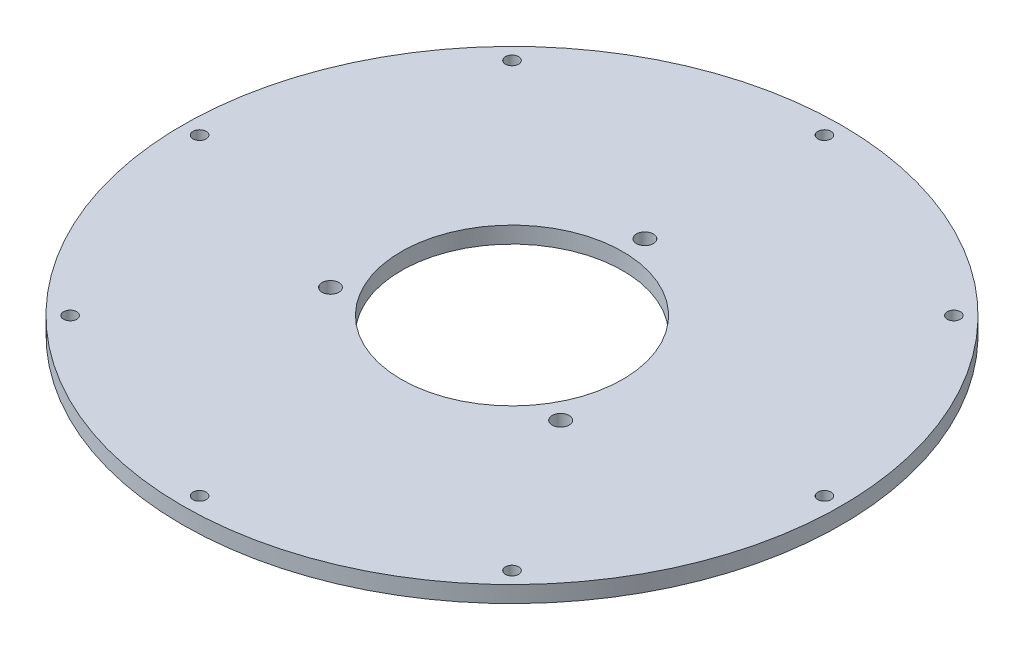
ISO-10303-21;
HEADER;
FILE_DESCRIPTION(('STEP AP214'),'2;1');
FILE_NAME('part.step','',(''),(''),'','','');
FILE_SCHEMA(('AUTOMOTIVE_DESIGN { 1 0 10303 214 1 1 1 1 }'));
ENDSEC;
DATA;
#1=APPLICATION_CONTEXT('core data for automotive mechanical design processes');
#2=APPLICATION_PROTOCOL_DEFINITION('international standard','automotive_design',2000,#1);
#3=PRODUCT_CONTEXT('',#1,'mechanical');
#4=PRODUCT('Part','Part','',(#3));
#5=PRODUCT_RELATED_PRODUCT_CATEGORY('part','',(#4));
#6=PRODUCT_DEFINITION_FORMATION('','',#4);
#7=PRODUCT_DEFINITION_CONTEXT('part definition',#1,'design');
#8=PRODUCT_DEFINITION('design','',#6,#7);
#9=PRODUCT_DEFINITION_SHAPE('','',#8);
#10=(LENGTH_UNIT() NAMED_UNIT(*) SI_UNIT(.MILLI.,.METRE.));
#11=(NAMED_UNIT(*) PLANE_ANGLE_UNIT() SI_UNIT($,.RADIAN.));
#12=(NAMED_UNIT(*) SI_UNIT($,.STERADIAN.) SOLID_ANGLE_UNIT());
#13=UNCERTAINTY_MEASURE_WITH_UNIT(LENGTH_MEASURE(1.E-05),#10,'distance_accuracy_value','');
#14=(GEOMETRIC_REPRESENTATION_CONTEXT(3) GLOBAL_UNCERTAINTY_ASSIGNED_CONTEXT((#13)) GLOBAL_UNIT_ASSIGNED_CONTEXT((#10,
#11,#12)) REPRESENTATION_CONTEXT('',''));
#15=CARTESIAN_POINT('',(0.,0.,0.));
#16=DIRECTION('',(0.,0.,1.));
#17=DIRECTION('',(1.,0.,0.));
#18=AXIS2_PLACEMENT_3D('',#15,#16,#17);
#19=CARTESIAN_POINT('',(0.,3.125,0.));
#20=DIRECTION('',(0.,1.,0.));
#21=DIRECTION('',(0.,0.,1.));
#22=AXIS2_PLACEMENT_3D('',#19,#20,#21);
#23=PLANE('',#22);
#24=CARTESIAN_POINT('',(-59.25,3.125,0.));
#25=DIRECTION('',(0.,1.,0.));
#26=DIRECTION('',(0.,0.,1.));
#27=AXIS2_PLACEMENT_3D('',#24,#25,#26);
#28=CIRCLE('',#27,1.25);
#29=CARTESIAN_POINT('',(-59.25,3.125,1.25000000000001));
#30=VERTEX_POINT('',#29);
#31=EDGE_CURVE('E94',#30,#30,#28,.T.);
#32=ORIENTED_EDGE('',*,*,#31,.F.);
#33=EDGE_LOOP('',(#32));
#34=FACE_BOUND('',#33,.T.);
#35=CARTESIAN_POINT('',(41.8960767853029,3.125,41.8960767853029));
#36=DIRECTION('',(0.,1.,0.));
#37=DIRECTION('',(0.,0.,1.));
#38=AXIS2_PLACEMENT_3D('',#35,#36,#37);
#39=CIRCLE('',#38,1.25);
#40=CARTESIAN_POINT('',(41.8960767853029,3.125,43.146076785303));
#41=VERTEX_POINT('',#40);
#42=EDGE_CURVE('E83',#41,#41,#39,.T.);
#43=ORIENTED_EDGE('',*,*,#42,.F.);
#44=EDGE_LOOP('',(#43));
#45=FACE_BOUND('',#44,.T.);
#46=CARTESIAN_POINT('',(-41.8960767853029,3.125,41.8960767853029));
#47=DIRECTION('',(0.,1.,0.));
#48=DIRECTION('',(0.,0.,1.));
#49=AXIS2_PLACEMENT_3D('',#46,#47,#48);
#50=CIRCLE('',#49,1.25);
#51=CARTESIAN_POINT('',(-41.8960767853029,3.125,43.1460767853029));
#52=VERTEX_POINT('',#51);
#53=EDGE_CURVE('E82',#52,#52,#50,.T.);
#54=ORIENTED_EDGE('',*,*,#53,.F.);
#55=EDGE_LOOP('',(#54));
#56=FACE_BOUND('',#55,.T.);
#57=CARTESIAN_POINT('',(41.8960767853029,3.125,-41.8960767853029));
#58=DIRECTION('',(0.,1.,0.));
#59=DIRECTION('',(0.,0.,1.));
#60=AXIS2_PLACEMENT_3D('',#57,#58,#59);
#61=CIRCLE('',#60,1.25);
#62=CARTESIAN_POINT('',(41.8960767853029,3.125,-40.6460767853029));
#63=VERTEX_POINT('',#62);
#64=EDGE_CURVE('E76',#63,#63,#61,.T.);
#65=ORIENTED_EDGE('',*,*,#64,.F.);
#66=EDGE_LOOP('',(#65));
#67=FACE_BOUND('',#66,.T.);
#68=CARTESIAN_POINT('',(59.25,3.125,0.));
#69=DIRECTION('',(0.,1.,0.));
#70=DIRECTION('',(0.,0.,1.));
#71=AXIS2_PLACEMENT_3D('',#68,#69,#70);
#72=CIRCLE('',#71,1.25);
#73=CARTESIAN_POINT('',(59.25,3.125,1.24999999999997));
#74=VERTEX_POINT('',#73);
#75=EDGE_CURVE('E95',#74,#74,#72,.T.);
#76=ORIENTED_EDGE('',*,*,#75,.F.);
#77=EDGE_LOOP('',(#76));
#78=FACE_BOUND('',#77,.T.);
#79=CARTESIAN_POINT('',(0.,3.125,-59.25));
#80=DIRECTION('',(0.,1.,0.));
#81=DIRECTION('',(0.,0.,1.));
#82=AXIS2_PLACEMENT_3D('',#79,#80,#81);
#83=CIRCLE('',#82,1.25);
#84=CARTESIAN_POINT('',(0.,3.125,-58.));
#85=VERTEX_POINT('',#84);
#86=EDGE_CURVE('E112',#85,#85,#83,.T.);
#87=ORIENTED_EDGE('',*,*,#86,.F.);
#88=EDGE_LOOP('',(#87));
#89=FACE_BOUND('',#88,.T.);
#90=CARTESIAN_POINT('',(0.,3.125,59.25));
#91=DIRECTION('',(0.,1.,0.));
#92=DIRECTION('',(0.,0.,1.));
#93=AXIS2_PLACEMENT_3D('',#90,#91,#92);
#94=CIRCLE('',#93,1.25);
#95=CARTESIAN_POINT('',(0.,3.125,60.5));
#96=VERTEX_POINT('',#95);
#97=EDGE_CURVE('E106',#96,#96,#94,.T.);
#98=ORIENTED_EDGE('',*,*,#97,.F.);
#99=EDGE_LOOP('',(#98));
#100=FACE_BOUND('',#99,.T.);
#101=CARTESIAN_POINT('',(-41.8960767853029,3.125,-41.8960767853029));
#102=DIRECTION('',(0.,1.,0.));
#103=DIRECTION('',(0.,0.,1.));
#104=AXIS2_PLACEMENT_3D('',#101,#102,#103);
#105=CIRCLE('',#104,1.25);
#106=CARTESIAN_POINT('',(-41.8960767853029,3.125,-40.6460767853029));
#107=VERTEX_POINT('',#106);
#108=EDGE_CURVE('E73',#107,#107,#105,.T.);
#109=ORIENTED_EDGE('',*,*,#108,.F.);
#110=EDGE_LOOP('',(#109));
#111=FACE_BOUND('',#110,.T.);
#112=CARTESIAN_POINT('',(1.39713240976391E-13,3.125,-25.2));
#113=DIRECTION('',(0.,1.,0.));
#114=DIRECTION('',(0.,0.,1.));
#115=AXIS2_PLACEMENT_3D('',#112,#113,#114);
#116=CIRCLE('',#115,1.6);
#117=CARTESIAN_POINT('',(1.39713240976391E-13,3.125,-23.6));
#118=VERTEX_POINT('',#117);
#119=EDGE_CURVE('E68',#118,#118,#116,.T.);
#120=ORIENTED_EDGE('',*,*,#119,.F.);
#121=EDGE_LOOP('',(#120));
#122=FACE_BOUND('',#121,.T.);
#123=CARTESIAN_POINT('',(21.8238401753678,3.125,12.6000000000001));
#124=DIRECTION('',(0.,1.,0.));
#125=DIRECTION('',(0.,0.,1.));
#126=AXIS2_PLACEMENT_3D('',#123,#124,#125);
#127=CIRCLE('',#126,1.6);
#128=CARTESIAN_POINT('',(21.8238401753678,3.125,14.2000000000001));
#129=VERTEX_POINT('',#128);
#130=EDGE_CURVE('E65',#129,#129,#127,.T.);
#131=ORIENTED_EDGE('',*,*,#130,.F.);
#132=EDGE_LOOP('',(#131));
#133=FACE_BOUND('',#132,.T.);
#134=CARTESIAN_POINT('',(-21.8238401753679,3.125,12.5999999999999));
#135=DIRECTION('',(0.,1.,0.));
#136=DIRECTION('',(0.,0.,1.));
#137=AXIS2_PLACEMENT_3D('',#134,#135,#136);
#138=CIRCLE('',#137,1.6);
#139=CARTESIAN_POINT('',(-21.8238401753679,3.125,14.1999999999999));
#140=VERTEX_POINT('',#139);
#141=EDGE_CURVE('E58',#140,#140,#138,.T.);
#142=ORIENTED_EDGE('',*,*,#141,.F.);
#143=EDGE_LOOP('',(#142));
#144=FACE_BOUND('',#143,.T.);
#145=CARTESIAN_POINT('',(0.,3.125,0.));
#146=DIRECTION('',(0.,1.,0.));
#147=DIRECTION('',(0.,0.,1.));
#148=AXIS2_PLACEMENT_3D('',#145,#146,#147);
#149=CIRCLE('',#148,62.5);
#150=CARTESIAN_POINT('',(0.,3.125,62.5));
#151=VERTEX_POINT('',#150);
#152=EDGE_CURVE('E10',#151,#151,#149,.T.);
#153=ORIENTED_EDGE('',*,*,#152,.T.);
#154=EDGE_LOOP('',(#153));
#155=FACE_BOUND('',#154,.T.);
#156=CARTESIAN_POINT('',(0.,3.125,0.));
#157=DIRECTION('',(0.,1.,0.));
#158=DIRECTION('',(0.,0.,1.));
#159=AXIS2_PLACEMENT_3D('',#156,#157,#158);
#160=CIRCLE('',#159,21.);
#161=CARTESIAN_POINT('',(0.,3.125,21.));
#162=VERTEX_POINT('',#161);
#163=EDGE_CURVE('E47',#162,#162,#160,.T.);
#164=ORIENTED_EDGE('',*,*,#163,.F.);
#165=EDGE_LOOP('',(#164));
#166=FACE_BOUND('',#165,.T.);
#167=ADVANCED_FACE('F36',(#34,#45,#56,#67,#78,#89,#100,#111,#122,#133,#144,#155,#166),#23,.T.);
#168=CARTESIAN_POINT('',(0.,0.,0.));
#169=DIRECTION('',(0.,1.,0.));
#170=DIRECTION('',(0.,0.,1.));
#171=AXIS2_PLACEMENT_3D('',#168,#169,#170);
#172=PLANE('',#171);
#173=CARTESIAN_POINT('',(-59.25,0.,0.));
#174=DIRECTION('',(0.,1.,0.));
#175=DIRECTION('',(0.,0.,1.));
#176=AXIS2_PLACEMENT_3D('',#173,#174,#175);
#177=CIRCLE('',#176,1.25);
#178=CARTESIAN_POINT('',(-59.25,0.,1.25000000000001));
#179=VERTEX_POINT('',#178);
#180=EDGE_CURVE('E91',#179,#179,#177,.T.);
#181=ORIENTED_EDGE('',*,*,#180,.T.);
#182=EDGE_LOOP('',(#181));
#183=FACE_BOUND('',#182,.T.);
#184=CARTESIAN_POINT('',(41.8960767853029,0.,41.8960767853029));
#185=DIRECTION('',(0.,1.,0.));
#186=DIRECTION('',(0.,0.,1.));
#187=AXIS2_PLACEMENT_3D('',#184,#185,#186);
#188=CIRCLE('',#187,1.25);
#189=CARTESIAN_POINT('',(41.8960767853029,0.,43.146076785303));
#190=VERTEX_POINT('',#189);
#191=EDGE_CURVE('E98',#190,#190,#188,.T.);
#192=ORIENTED_EDGE('',*,*,#191,.T.);
#193=EDGE_LOOP('',(#192));
#194=FACE_BOUND('',#193,.T.);
#195=CARTESIAN_POINT('',(-41.8960767853029,0.,41.8960767853029));
#196=DIRECTION('',(0.,1.,0.));
#197=DIRECTION('',(0.,0.,1.));
#198=AXIS2_PLACEMENT_3D('',#195,#196,#197);
#199=CIRCLE('',#198,1.25);
#200=CARTESIAN_POINT('',(-41.8960767853029,0.,43.1460767853029));
#201=VERTEX_POINT('',#200);
#202=EDGE_CURVE('E79',#201,#201,#199,.T.);
#203=ORIENTED_EDGE('',*,*,#202,.T.);
#204=EDGE_LOOP('',(#203));
#205=FACE_BOUND('',#204,.T.);
#206=CARTESIAN_POINT('',(41.8960767853029,0.,-41.8960767853029));
#207=DIRECTION('',(0.,1.,0.));
#208=DIRECTION('',(0.,0.,1.));
#209=AXIS2_PLACEMENT_3D('',#206,#207,#208);
#210=CIRCLE('',#209,1.25);
#211=CARTESIAN_POINT('',(41.8960767853029,0.,-40.6460767853029));
#212=VERTEX_POINT('',#211);
#213=EDGE_CURVE('E86',#212,#212,#210,.T.);
#214=ORIENTED_EDGE('',*,*,#213,.T.);
#215=EDGE_LOOP('',(#214));
#216=FACE_BOUND('',#215,.T.);
#217=CARTESIAN_POINT('',(59.25,0.,0.));
#218=DIRECTION('',(0.,1.,0.));
#219=DIRECTION('',(0.,0.,1.));
#220=AXIS2_PLACEMENT_3D('',#217,#218,#219);
#221=CIRCLE('',#220,1.25);
#222=CARTESIAN_POINT('',(59.25,0.,1.24999999999997));
#223=VERTEX_POINT('',#222);
#224=EDGE_CURVE('E115',#223,#223,#221,.T.);
#225=ORIENTED_EDGE('',*,*,#224,.T.);
#226=EDGE_LOOP('',(#225));
#227=FACE_BOUND('',#226,.T.);
#228=CARTESIAN_POINT('',(0.,0.,-59.25));
#229=DIRECTION('',(0.,1.,0.));
#230=DIRECTION('',(0.,0.,1.));
#231=AXIS2_PLACEMENT_3D('',#228,#229,#230);
#232=CIRCLE('',#231,1.25);
#233=CARTESIAN_POINT('',(0.,0.,-58.));
#234=VERTEX_POINT('',#233);
#235=EDGE_CURVE('E109',#234,#234,#232,.T.);
#236=ORIENTED_EDGE('',*,*,#235,.T.);
#237=EDGE_LOOP('',(#236));
#238=FACE_BOUND('',#237,.T.);
#239=CARTESIAN_POINT('',(0.,0.,59.25));
#240=DIRECTION('',(0.,1.,0.));
#241=DIRECTION('',(0.,0.,1.));
#242=AXIS2_PLACEMENT_3D('',#239,#240,#241);
#243=CIRCLE('',#242,1.25);
#244=CARTESIAN_POINT('',(0.,0.,60.5));
#245=VERTEX_POINT('',#244);
#246=EDGE_CURVE('E103',#245,#245,#243,.T.);
#247=ORIENTED_EDGE('',*,*,#246,.T.);
#248=EDGE_LOOP('',(#247));
#249=FACE_BOUND('',#248,.T.);
#250=CARTESIAN_POINT('',(-41.8960767853029,0.,-41.8960767853029));
#251=DIRECTION('',(0.,1.,0.));
#252=DIRECTION('',(0.,0.,1.));
#253=AXIS2_PLACEMENT_3D('',#250,#251,#252);
#254=CIRCLE('',#253,1.25);
#255=CARTESIAN_POINT('',(-41.8960767853029,0.,-40.6460767853029));
#256=VERTEX_POINT('',#255);
#257=EDGE_CURVE('E59',#256,#256,#254,.T.);
#258=ORIENTED_EDGE('',*,*,#257,.T.);
#259=EDGE_LOOP('',(#258));
#260=FACE_BOUND('',#259,.T.);
#261=CARTESIAN_POINT('',(1.39713240976391E-13,0.,-25.2));
#262=DIRECTION('',(0.,1.,0.));
#263=DIRECTION('',(0.,0.,1.));
#264=AXIS2_PLACEMENT_3D('',#261,#262,#263);
#265=CIRCLE('',#264,1.6);
#266=CARTESIAN_POINT('',(1.39713240976391E-13,0.,-23.6));
#267=VERTEX_POINT('',#266);
#268=EDGE_CURVE('E52',#267,#267,#265,.T.);
#269=ORIENTED_EDGE('',*,*,#268,.T.);
#270=EDGE_LOOP('',(#269));
#271=FACE_BOUND('',#270,.T.);
#272=CARTESIAN_POINT('',(21.8238401753678,0.,12.6000000000001));
#273=DIRECTION('',(0.,1.,0.));
#274=DIRECTION('',(0.,0.,1.));
#275=AXIS2_PLACEMENT_3D('',#272,#273,#274);
#276=CIRCLE('',#275,1.6);
#277=CARTESIAN_POINT('',(21.8238401753678,0.,14.2000000000001));
#278=VERTEX_POINT('',#277);
#279=EDGE_CURVE('E62',#278,#278,#276,.T.);
#280=ORIENTED_EDGE('',*,*,#279,.T.);
#281=EDGE_LOOP('',(#280));
#282=FACE_BOUND('',#281,.T.);
#283=CARTESIAN_POINT('',(-21.8238401753679,0.,12.5999999999999));
#284=DIRECTION('',(0.,1.,0.));
#285=DIRECTION('',(0.,0.,1.));
#286=AXIS2_PLACEMENT_3D('',#283,#284,#285);
#287=CIRCLE('',#286,1.6);
#288=CARTESIAN_POINT('',(-21.8238401753679,0.,14.1999999999999));
#289=VERTEX_POINT('',#288);
#290=EDGE_CURVE('E55',#289,#289,#287,.T.);
#291=ORIENTED_EDGE('',*,*,#290,.T.);
#292=EDGE_LOOP('',(#291));
#293=FACE_BOUND('',#292,.T.);
#294=CARTESIAN_POINT('',(0.,0.,0.));
#295=DIRECTION('',(0.,1.,0.));
#296=DIRECTION('',(0.,0.,1.));
#297=AXIS2_PLACEMENT_3D('',#294,#295,#296);
#298=CIRCLE('',#297,62.5);
#299=CARTESIAN_POINT('',(0.,0.,62.5));
#300=VERTEX_POINT('',#299);
#301=EDGE_CURVE('E40',#300,#300,#298,.T.);
#302=ORIENTED_EDGE('',*,*,#301,.F.);
#303=EDGE_LOOP('',(#302));
#304=FACE_BOUND('',#303,.T.);
#305=CARTESIAN_POINT('',(0.,0.,0.));
#306=DIRECTION('',(0.,1.,0.));
#307=DIRECTION('',(0.,0.,1.));
#308=AXIS2_PLACEMENT_3D('',#305,#306,#307);
#309=CIRCLE('',#308,21.);
#310=CARTESIAN_POINT('',(0.,0.,21.));
#311=VERTEX_POINT('',#310);
#312=EDGE_CURVE('E49',#311,#311,#309,.T.);
#313=ORIENTED_EDGE('',*,*,#312,.T.);
#314=EDGE_LOOP('',(#313));
#315=FACE_BOUND('',#314,.T.);
#316=ADVANCED_FACE('F125',(#183,#194,#205,#216,#227,#238,#249,#260,#271,#282,#293,#304,#315),
#172,.F.);
#317=CARTESIAN_POINT('',(0.,3.125,0.));
#318=DIRECTION('',(0.,-1.,0.));
#319=DIRECTION('',(0.,0.,-1.));
#320=AXIS2_PLACEMENT_3D('',#317,#318,#319);
#321=CYLINDRICAL_SURFACE('',#320,62.5);
#322=ORIENTED_EDGE('',*,*,#152,.F.);
#323=EDGE_LOOP('',(#322));
#324=FACE_BOUND('',#323,.T.);
#325=ORIENTED_EDGE('',*,*,#301,.T.);
#326=EDGE_LOOP('',(#325));
#327=FACE_BOUND('',#326,.T.);
#328=ADVANCED_FACE('F38',(#324,#327),#321,.T.);
#329=CARTESIAN_POINT('',(0.,3.125,0.));
#330=DIRECTION('',(0.,-1.,0.));
#331=DIRECTION('',(0.,0.,-1.));
#332=AXIS2_PLACEMENT_3D('',#329,#330,#331);
#333=CYLINDRICAL_SURFACE('',#332,21.);
#334=ORIENTED_EDGE('',*,*,#163,.T.);
#335=EDGE_LOOP('',(#334));
#336=FACE_BOUND('',#335,.T.);
#337=ORIENTED_EDGE('',*,*,#312,.F.);
#338=EDGE_LOOP('',(#337));
#339=FACE_BOUND('',#338,.T.);
#340=ADVANCED_FACE('F142',(#336,#339),#333,.F.);
#341=CARTESIAN_POINT('',(-21.8238401753679,0.,12.5999999999999));
#342=DIRECTION('',(0.,1.,0.));
#343=DIRECTION('',(0.,0.,1.));
#344=AXIS2_PLACEMENT_3D('',#341,#342,#343);
#345=CYLINDRICAL_SURFACE('',#344,1.6);
#346=ORIENTED_EDGE('',*,*,#290,.F.);
#347=EDGE_LOOP('',(#346));
#348=FACE_BOUND('',#347,.T.);
#349=ORIENTED_EDGE('',*,*,#141,.T.);
#350=EDGE_LOOP('',(#349));
#351=FACE_BOUND('',#350,.T.);
#352=ADVANCED_FACE('F145',(#348,#351),#345,.F.);
#353=CARTESIAN_POINT('',(21.8238401753678,0.,12.6000000000001));
#354=DIRECTION('',(0.,1.,0.));
#355=DIRECTION('',(0.,0.,1.));
#356=AXIS2_PLACEMENT_3D('',#353,#354,#355);
#357=CYLINDRICAL_SURFACE('',#356,1.6);
#358=ORIENTED_EDGE('',*,*,#279,.F.);
#359=EDGE_LOOP('',(#358));
#360=FACE_BOUND('',#359,.T.);
#361=ORIENTED_EDGE('',*,*,#130,.T.);
#362=EDGE_LOOP('',(#361));
#363=FACE_BOUND('',#362,.T.);
#364=ADVANCED_FACE('F160',(#360,#363),#357,.F.);
#365=CARTESIAN_POINT('',(1.39713240976391E-13,0.,-25.2));
#366=DIRECTION('',(0.,1.,0.));
#367=DIRECTION('',(0.,0.,1.));
#368=AXIS2_PLACEMENT_3D('',#365,#366,#367);
#369=CYLINDRICAL_SURFACE('',#368,1.6);
#370=ORIENTED_EDGE('',*,*,#268,.F.);
#371=EDGE_LOOP('',(#370));
#372=FACE_BOUND('',#371,.T.);
#373=ORIENTED_EDGE('',*,*,#119,.T.);
#374=EDGE_LOOP('',(#373));
#375=FACE_BOUND('',#374,.T.);
#376=ADVANCED_FACE('F164',(#372,#375),#369,.F.);
#377=CARTESIAN_POINT('',(-41.8960767853029,0.,-41.8960767853029));
#378=DIRECTION('',(0.,1.,0.));
#379=DIRECTION('',(0.,0.,1.));
#380=AXIS2_PLACEMENT_3D('',#377,#378,#379);
#381=CYLINDRICAL_SURFACE('',#380,1.25);
#382=ORIENTED_EDGE('',*,*,#257,.F.);
#383=EDGE_LOOP('',(#382));
#384=FACE_BOUND('',#383,.T.);
#385=ORIENTED_EDGE('',*,*,#108,.T.);
#386=EDGE_LOOP('',(#385));
#387=FACE_BOUND('',#386,.T.);
#388=ADVANCED_FACE('F168',(#384,#387),#381,.F.);
#389=CARTESIAN_POINT('',(0.,0.,59.25));
#390=DIRECTION('',(0.,1.,0.));
#391=DIRECTION('',(0.,0.,1.));
#392=AXIS2_PLACEMENT_3D('',#389,#390,#391);
#393=CYLINDRICAL_SURFACE('',#392,1.25);
#394=ORIENTED_EDGE('',*,*,#246,.F.);
#395=EDGE_LOOP('',(#394));
#396=FACE_BOUND('',#395,.T.);
#397=ORIENTED_EDGE('',*,*,#97,.T.);
#398=EDGE_LOOP('',(#397));
#399=FACE_BOUND('',#398,.T.);
#400=ADVANCED_FACE('F171',(#396,#399),#393,.F.);
#401=CARTESIAN_POINT('',(0.,0.,-59.25));
#402=DIRECTION('',(0.,1.,0.));
#403=DIRECTION('',(0.,0.,1.));
#404=AXIS2_PLACEMENT_3D('',#401,#402,#403);
#405=CYLINDRICAL_SURFACE('',#404,1.25);
#406=ORIENTED_EDGE('',*,*,#235,.F.);
#407=EDGE_LOOP('',(#406));
#408=FACE_BOUND('',#407,.T.);
#409=ORIENTED_EDGE('',*,*,#86,.T.);
#410=EDGE_LOOP('',(#409));
#411=FACE_BOUND('',#410,.T.);
#412=ADVANCED_FACE('F191',(#408,#411),#405,.F.);
#413=CARTESIAN_POINT('',(59.25,0.,0.));
#414=DIRECTION('',(0.,1.,0.));
#415=DIRECTION('',(0.,0.,1.));
#416=AXIS2_PLACEMENT_3D('',#413,#414,#415);
#417=CYLINDRICAL_SURFACE('',#416,1.25);
#418=ORIENTED_EDGE('',*,*,#224,.F.);
#419=EDGE_LOOP('',(#418));
#420=FACE_BOUND('',#419,.T.);
#421=ORIENTED_EDGE('',*,*,#75,.T.);
#422=EDGE_LOOP('',(#421));
#423=FACE_BOUND('',#422,.T.);
#424=ADVANCED_FACE('F121',(#420,#423),#417,.F.);
#425=CARTESIAN_POINT('',(41.8960767853029,0.,-41.8960767853029));
#426=DIRECTION('',(0.,1.,0.));
#427=DIRECTION('',(0.,0.,1.));
#428=AXIS2_PLACEMENT_3D('',#425,#426,#427);
#429=CYLINDRICAL_SURFACE('',#428,1.25);
#430=ORIENTED_EDGE('',*,*,#213,.F.);
#431=EDGE_LOOP('',(#430));
#432=FACE_BOUND('',#431,.T.);
#433=ORIENTED_EDGE('',*,*,#64,.T.);
#434=EDGE_LOOP('',(#433));
#435=FACE_BOUND('',#434,.T.);
#436=ADVANCED_FACE('F177',(#432,#435),#429,.F.);
#437=CARTESIAN_POINT('',(-41.8960767853029,0.,41.8960767853029));
#438=DIRECTION('',(0.,1.,0.));
#439=DIRECTION('',(0.,0.,1.));
#440=AXIS2_PLACEMENT_3D('',#437,#438,#439);
#441=CYLINDRICAL_SURFACE('',#440,1.25);
#442=ORIENTED_EDGE('',*,*,#202,.F.);
#443=EDGE_LOOP('',(#442));
#444=FACE_BOUND('',#443,.T.);
#445=ORIENTED_EDGE('',*,*,#53,.T.);
#446=EDGE_LOOP('',(#445));
#447=FACE_BOUND('',#446,.T.);
#448=ADVANCED_FACE('F173',(#444,#447),#441,.F.);
#449=CARTESIAN_POINT('',(41.8960767853029,0.,41.8960767853029));
#450=DIRECTION('',(0.,1.,0.));
#451=DIRECTION('',(0.,0.,1.));
#452=AXIS2_PLACEMENT_3D('',#449,#450,#451);
#453=CYLINDRICAL_SURFACE('',#452,1.25);
#454=ORIENTED_EDGE('',*,*,#191,.F.);
#455=EDGE_LOOP('',(#454));
#456=FACE_BOUND('',#455,.T.);
#457=ORIENTED_EDGE('',*,*,#42,.T.);
#458=EDGE_LOOP('',(#457));
#459=FACE_BOUND('',#458,.T.);
#460=ADVANCED_FACE('F176',(#456,#459),#453,.F.);
#461=CARTESIAN_POINT('',(-59.25,0.,0.));
#462=DIRECTION('',(0.,1.,0.));
#463=DIRECTION('',(0.,0.,1.));
#464=AXIS2_PLACEMENT_3D('',#461,#462,#463);
#465=CYLINDRICAL_SURFACE('',#464,1.25);
#466=ORIENTED_EDGE('',*,*,#180,.F.);
#467=EDGE_LOOP('',(#466));
#468=FACE_BOUND('',#467,.T.);
#469=ORIENTED_EDGE('',*,*,#31,.T.);
#470=EDGE_LOOP('',(#469));
#471=FACE_BOUND('',#470,.T.);
#472=ADVANCED_FACE('F182',(#468,#471),#465,.F.);
#473=CLOSED_SHELL('',(#167,#316,#328,#340,#352,#364,#376,#388,#400,#412,#424,#436,#448,#460,#472));
#474=MANIFOLD_SOLID_BREP('B2',#473);
#475=ADVANCED_BREP_SHAPE_REPRESENTATION('',(#18,#474),#14);
#476=SHAPE_DEFINITION_REPRESENTATION(#9,#475);
ENDSEC;
END-ISO-10303-21;
